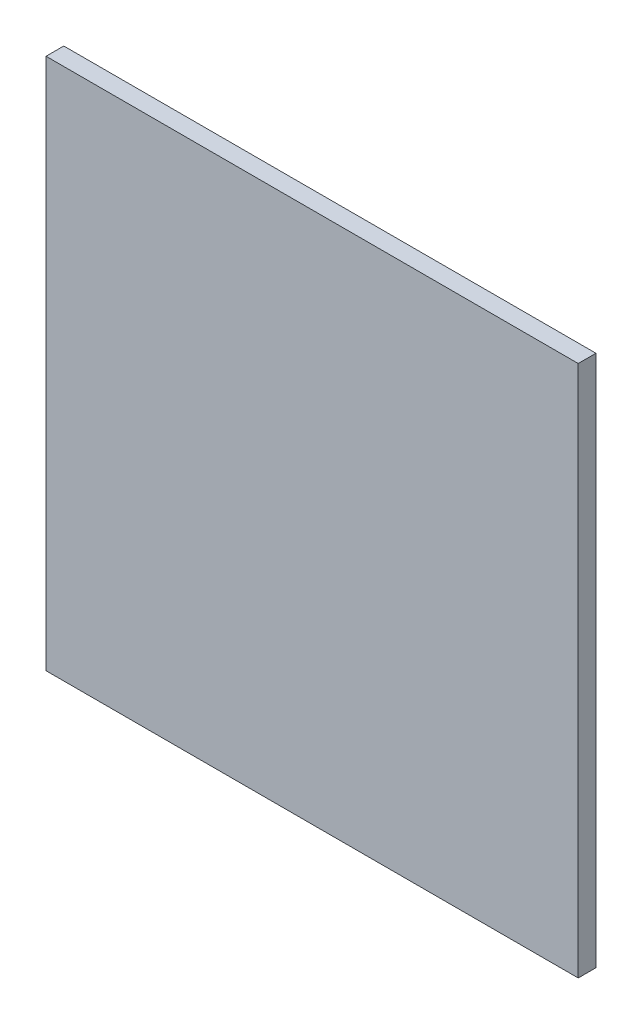
ISO-10303-21;
HEADER;
FILE_DESCRIPTION(('STEP AP214'),'2;1');
FILE_NAME('part.step','',(''),(''),'','','');
FILE_SCHEMA(('AUTOMOTIVE_DESIGN { 1 0 10303 214 1 1 1 1 }'));
ENDSEC;
DATA;
#1=APPLICATION_CONTEXT('core data for automotive mechanical design processes');
#2=APPLICATION_PROTOCOL_DEFINITION('international standard','automotive_design',2000,#1);
#3=PRODUCT_CONTEXT('',#1,'mechanical');
#4=PRODUCT('Part','Part','',(#3));
#5=PRODUCT_RELATED_PRODUCT_CATEGORY('part','',(#4));
#6=PRODUCT_DEFINITION_FORMATION('','',#4);
#7=PRODUCT_DEFINITION_CONTEXT('part definition',#1,'design');
#8=PRODUCT_DEFINITION('design','',#6,#7);
#9=PRODUCT_DEFINITION_SHAPE('','',#8);
#10=(LENGTH_UNIT() NAMED_UNIT(*) SI_UNIT(.MILLI.,.METRE.));
#11=(NAMED_UNIT(*) PLANE_ANGLE_UNIT() SI_UNIT($,.RADIAN.));
#12=(NAMED_UNIT(*) SI_UNIT($,.STERADIAN.) SOLID_ANGLE_UNIT());
#13=UNCERTAINTY_MEASURE_WITH_UNIT(LENGTH_MEASURE(1.E-05),#10,'distance_accuracy_value','');
#14=(GEOMETRIC_REPRESENTATION_CONTEXT(3) GLOBAL_UNCERTAINTY_ASSIGNED_CONTEXT((#13)) GLOBAL_UNIT_ASSIGNED_CONTEXT((#10,
#11,#12)) REPRESENTATION_CONTEXT('',''));
#15=CARTESIAN_POINT('',(0.,0.,0.));
#16=DIRECTION('',(0.,0.,1.));
#17=DIRECTION('',(1.,0.,0.));
#18=AXIS2_PLACEMENT_3D('',#15,#16,#17);
#19=CARTESIAN_POINT('',(0.3,-0.3,0.01));
#20=DIRECTION('',(-1.,0.,0.));
#21=DIRECTION('',(0.,0.,1.));
#22=AXIS2_PLACEMENT_3D('',#19,#20,#21);
#23=PLANE('',#22);
#24=DIRECTION('',(0.,1.,0.));
#25=VECTOR('',#24,1.);
#26=CARTESIAN_POINT('',(0.3,-0.3,-0.01));
#27=LINE('',#26,#25);
#28=CARTESIAN_POINT('',(0.3,-0.3,-0.01));
#29=VERTEX_POINT('',#28);
#30=CARTESIAN_POINT('',(0.3,0.3,-0.01));
#31=VERTEX_POINT('',#30);
#32=EDGE_CURVE('E96',#29,#31,#27,.T.);
#33=ORIENTED_EDGE('',*,*,#32,.T.);
#34=DIRECTION('',(0.,0.,-1.));
#35=VECTOR('',#34,1.);
#36=CARTESIAN_POINT('',(0.3,0.3,0.01));
#37=LINE('',#36,#35);
#38=CARTESIAN_POINT('',(0.3,0.3,0.01));
#39=VERTEX_POINT('',#38);
#40=EDGE_CURVE('E11',#39,#31,#37,.T.);
#41=ORIENTED_EDGE('',*,*,#40,.F.);
#42=DIRECTION('',(0.,1.,0.));
#43=VECTOR('',#42,1.);
#44=CARTESIAN_POINT('',(0.3,-0.3,0.01));
#45=LINE('',#44,#43);
#46=CARTESIAN_POINT('',(0.3,-0.3,0.01));
#47=VERTEX_POINT('',#46);
#48=EDGE_CURVE('E84',#47,#39,#45,.T.);
#49=ORIENTED_EDGE('',*,*,#48,.F.);
#50=DIRECTION('',(0.,0.,-1.));
#51=VECTOR('',#50,1.);
#52=CARTESIAN_POINT('',(0.3,-0.3,0.01));
#53=LINE('',#52,#51);
#54=EDGE_CURVE('E92',#47,#29,#53,.T.);
#55=ORIENTED_EDGE('',*,*,#54,.T.);
#56=EDGE_LOOP('',(#33,#41,#49,#55));
#57=FACE_BOUND('',#56,.T.);
#58=ADVANCED_FACE('F33',(#57),#23,.F.);
#59=CARTESIAN_POINT('',(-0.3,0.3,0.01));
#60=DIRECTION('',(0.,-1.,0.));
#61=DIRECTION('',(0.,0.,-1.));
#62=AXIS2_PLACEMENT_3D('',#59,#60,#61);
#63=PLANE('',#62);
#64=DIRECTION('',(-1.,0.,0.));
#65=VECTOR('',#64,1.);
#66=CARTESIAN_POINT('',(-0.3,0.3,-0.01));
#67=LINE('',#66,#65);
#68=CARTESIAN_POINT('',(-0.3,0.3,-0.01));
#69=VERTEX_POINT('',#68);
#70=EDGE_CURVE('E88',#31,#69,#67,.T.);
#71=ORIENTED_EDGE('',*,*,#70,.T.);
#72=DIRECTION('',(0.,0.,-1.));
#73=VECTOR('',#72,1.);
#74=CARTESIAN_POINT('',(-0.3,0.3,0.01));
#75=LINE('',#74,#73);
#76=CARTESIAN_POINT('',(-0.3,0.3,0.01));
#77=VERTEX_POINT('',#76);
#78=EDGE_CURVE('E41',#77,#69,#75,.T.);
#79=ORIENTED_EDGE('',*,*,#78,.F.);
#80=DIRECTION('',(-1.,0.,0.));
#81=VECTOR('',#80,1.);
#82=CARTESIAN_POINT('',(-0.3,0.3,0.01));
#83=LINE('',#82,#81);
#84=EDGE_CURVE('E79',#39,#77,#83,.T.);
#85=ORIENTED_EDGE('',*,*,#84,.F.);
#86=ORIENTED_EDGE('',*,*,#40,.T.);
#87=EDGE_LOOP('',(#71,#79,#85,#86));
#88=FACE_BOUND('',#87,.T.);
#89=ADVANCED_FACE('F87',(#88),#63,.F.);
#90=CARTESIAN_POINT('',(-0.3,-0.3,0.01));
#91=DIRECTION('',(1.,0.,0.));
#92=DIRECTION('',(0.,0.,-1.));
#93=AXIS2_PLACEMENT_3D('',#90,#91,#92);
#94=PLANE('',#93);
#95=DIRECTION('',(0.,-1.,0.));
#96=VECTOR('',#95,1.);
#97=CARTESIAN_POINT('',(-0.3,-0.3,-0.01));
#98=LINE('',#97,#96);
#99=CARTESIAN_POINT('',(-0.3,-0.3,-0.01));
#100=VERTEX_POINT('',#99);
#101=EDGE_CURVE('E66',#69,#100,#98,.T.);
#102=ORIENTED_EDGE('',*,*,#101,.T.);
#103=DIRECTION('',(0.,0.,-1.));
#104=VECTOR('',#103,1.);
#105=CARTESIAN_POINT('',(-0.3,-0.3,0.01));
#106=LINE('',#105,#104);
#107=CARTESIAN_POINT('',(-0.3,-0.3,0.01));
#108=VERTEX_POINT('',#107);
#109=EDGE_CURVE('E89',#108,#100,#106,.T.);
#110=ORIENTED_EDGE('',*,*,#109,.F.);
#111=DIRECTION('',(0.,-1.,0.));
#112=VECTOR('',#111,1.);
#113=CARTESIAN_POINT('',(-0.3,-0.3,0.01));
#114=LINE('',#113,#112);
#115=EDGE_CURVE('E82',#77,#108,#114,.T.);
#116=ORIENTED_EDGE('',*,*,#115,.F.);
#117=ORIENTED_EDGE('',*,*,#78,.T.);
#118=EDGE_LOOP('',(#102,#110,#116,#117));
#119=FACE_BOUND('',#118,.T.);
#120=ADVANCED_FACE('F90',(#119),#94,.F.);
#121=CARTESIAN_POINT('',(-0.3,-0.3,0.01));
#122=DIRECTION('',(0.,1.,0.));
#123=DIRECTION('',(0.,0.,1.));
#124=AXIS2_PLACEMENT_3D('',#121,#122,#123);
#125=PLANE('',#124);
#126=DIRECTION('',(1.,0.,0.));
#127=VECTOR('',#126,1.);
#128=CARTESIAN_POINT('',(-0.3,-0.3,-0.01));
#129=LINE('',#128,#127);
#130=EDGE_CURVE('E72',#100,#29,#129,.T.);
#131=ORIENTED_EDGE('',*,*,#130,.T.);
#132=ORIENTED_EDGE('',*,*,#54,.F.);
#133=DIRECTION('',(1.,0.,0.));
#134=VECTOR('',#133,1.);
#135=CARTESIAN_POINT('',(-0.3,-0.3,0.01));
#136=LINE('',#135,#134);
#137=EDGE_CURVE('E49',#108,#47,#136,.T.);
#138=ORIENTED_EDGE('',*,*,#137,.F.);
#139=ORIENTED_EDGE('',*,*,#109,.T.);
#140=EDGE_LOOP('',(#131,#132,#138,#139));
#141=FACE_BOUND('',#140,.T.);
#142=ADVANCED_FACE('F103',(#141),#125,.F.);
#143=CARTESIAN_POINT('',(0.,0.,0.01));
#144=DIRECTION('',(0.,0.,-1.));
#145=DIRECTION('',(-1.,0.,0.));
#146=AXIS2_PLACEMENT_3D('',#143,#144,#145);
#147=PLANE('',#146);
#148=ORIENTED_EDGE('',*,*,#48,.T.);
#149=ORIENTED_EDGE('',*,*,#84,.T.);
#150=ORIENTED_EDGE('',*,*,#115,.T.);
#151=ORIENTED_EDGE('',*,*,#137,.T.);
#152=EDGE_LOOP('',(#148,#149,#150,#151));
#153=FACE_BOUND('',#152,.T.);
#154=ADVANCED_FACE('F80',(#153),#147,.F.);
#155=CARTESIAN_POINT('',(0.,0.,-0.01));
#156=DIRECTION('',(0.,0.,-1.));
#157=DIRECTION('',(-1.,0.,0.));
#158=AXIS2_PLACEMENT_3D('',#155,#156,#157);
#159=PLANE('',#158);
#160=ORIENTED_EDGE('',*,*,#32,.F.);
#161=ORIENTED_EDGE('',*,*,#130,.F.);
#162=ORIENTED_EDGE('',*,*,#101,.F.);
#163=ORIENTED_EDGE('',*,*,#70,.F.);
#164=EDGE_LOOP('',(#160,#161,#162,#163));
#165=FACE_BOUND('',#164,.T.);
#166=ADVANCED_FACE('F106',(#165),#159,.T.);
#167=CLOSED_SHELL('',(#58,#89,#120,#142,#154,#166));
#168=MANIFOLD_SOLID_BREP('B2',#167);
#169=ADVANCED_BREP_SHAPE_REPRESENTATION('',(#18,#168),#14);
#170=SHAPE_DEFINITION_REPRESENTATION(#9,#169);
ENDSEC;
END-ISO-10303-21;
